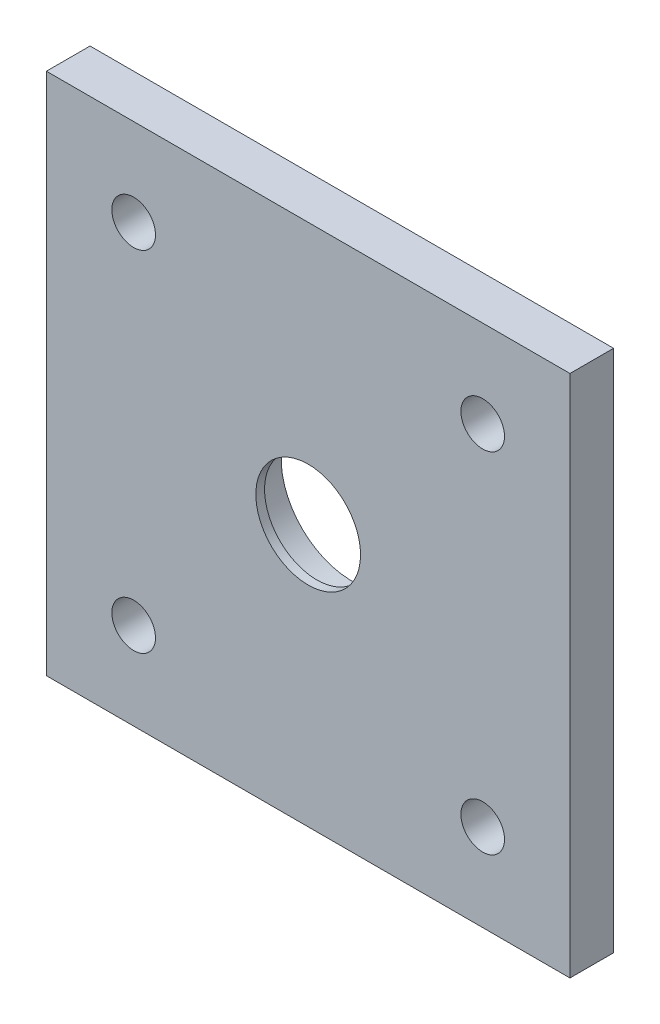
ISO-10303-21;
HEADER;
FILE_DESCRIPTION(('STEP AP214'),'2;1');
FILE_NAME('part.step','',(''),(''),'','','');
FILE_SCHEMA(('AUTOMOTIVE_DESIGN { 1 0 10303 214 1 1 1 1 }'));
ENDSEC;
DATA;
#1=APPLICATION_CONTEXT('core data for automotive mechanical design processes');
#2=APPLICATION_PROTOCOL_DEFINITION('international standard','automotive_design',2000,#1);
#3=PRODUCT_CONTEXT('',#1,'mechanical');
#4=PRODUCT('Part','Part','',(#3));
#5=PRODUCT_RELATED_PRODUCT_CATEGORY('part','',(#4));
#6=PRODUCT_DEFINITION_FORMATION('','',#4);
#7=PRODUCT_DEFINITION_CONTEXT('part definition',#1,'design');
#8=PRODUCT_DEFINITION('design','',#6,#7);
#9=PRODUCT_DEFINITION_SHAPE('','',#8);
#10=(LENGTH_UNIT() NAMED_UNIT(*) SI_UNIT(.MILLI.,.METRE.));
#11=(NAMED_UNIT(*) PLANE_ANGLE_UNIT() SI_UNIT($,.RADIAN.));
#12=(NAMED_UNIT(*) SI_UNIT($,.STERADIAN.) SOLID_ANGLE_UNIT());
#13=UNCERTAINTY_MEASURE_WITH_UNIT(LENGTH_MEASURE(1.E-05),#10,'distance_accuracy_value','');
#14=(GEOMETRIC_REPRESENTATION_CONTEXT(3) GLOBAL_UNCERTAINTY_ASSIGNED_CONTEXT((#13)) GLOBAL_UNIT_ASSIGNED_CONTEXT((#10,
#11,#12)) REPRESENTATION_CONTEXT('',''));
#15=CARTESIAN_POINT('',(0.,0.,0.));
#16=DIRECTION('',(0.,0.,1.));
#17=DIRECTION('',(1.,0.,0.));
#18=AXIS2_PLACEMENT_3D('',#15,#16,#17);
#19=CARTESIAN_POINT('',(0.,0.,6.34999999999999));
#20=DIRECTION('',(0.,0.,-1.));
#21=DIRECTION('',(-1.,0.,0.));
#22=AXIS2_PLACEMENT_3D('',#19,#20,#21);
#23=PLANE('',#22);
#24=CARTESIAN_POINT('',(-25.3999999999986,-25.4,6.34999999999998));
#25=DIRECTION('',(0.,0.,1.));
#26=DIRECTION('',(1.,0.,0.));
#27=AXIS2_PLACEMENT_3D('',#24,#25,#26);
#28=CIRCLE('',#27,3.175);
#29=CARTESIAN_POINT('',(-22.2249999999986,-25.4,6.34999999999998));
#30=VERTEX_POINT('',#29);
#31=EDGE_CURVE('E145',#30,#30,#28,.T.);
#32=ORIENTED_EDGE('',*,*,#31,.F.);
#33=EDGE_LOOP('',(#32));
#34=FACE_BOUND('',#33,.T.);
#35=CARTESIAN_POINT('',(25.4000000000014,-25.3999999999986,6.34999999999994));
#36=DIRECTION('',(0.,0.,1.));
#37=DIRECTION('',(1.,0.,0.));
#38=AXIS2_PLACEMENT_3D('',#35,#36,#37);
#39=CIRCLE('',#38,3.175);
#40=CARTESIAN_POINT('',(28.5750000000014,-25.3999999999986,6.34999999999994));
#41=VERTEX_POINT('',#40);
#42=EDGE_CURVE('E151',#41,#41,#39,.T.);
#43=ORIENTED_EDGE('',*,*,#42,.F.);
#44=EDGE_LOOP('',(#43));
#45=FACE_BOUND('',#44,.T.);
#46=CARTESIAN_POINT('',(25.4,25.4000000000014,6.34999999999999));
#47=DIRECTION('',(0.,0.,1.));
#48=DIRECTION('',(1.,0.,0.));
#49=AXIS2_PLACEMENT_3D('',#46,#47,#48);
#50=CIRCLE('',#49,3.175);
#51=CARTESIAN_POINT('',(28.575,25.4000000000014,6.34999999999999));
#52=VERTEX_POINT('',#51);
#53=EDGE_CURVE('E157',#52,#52,#50,.T.);
#54=ORIENTED_EDGE('',*,*,#53,.F.);
#55=EDGE_LOOP('',(#54));
#56=FACE_BOUND('',#55,.T.);
#57=CARTESIAN_POINT('',(-25.4,25.4,6.34999999999999));
#58=DIRECTION('',(0.,0.,1.));
#59=DIRECTION('',(1.,0.,0.));
#60=AXIS2_PLACEMENT_3D('',#57,#58,#59);
#61=CIRCLE('',#60,3.175);
#62=CARTESIAN_POINT('',(-22.225,25.4,6.34999999999999));
#63=VERTEX_POINT('',#62);
#64=EDGE_CURVE('E139',#63,#63,#61,.T.);
#65=ORIENTED_EDGE('',*,*,#64,.F.);
#66=EDGE_LOOP('',(#65));
#67=FACE_BOUND('',#66,.T.);
#68=DIRECTION('',(0.,1.,0.));
#69=VECTOR('',#68,1.);
#70=CARTESIAN_POINT('',(38.1,-38.1000000000001,6.34999999999994));
#71=LINE('',#70,#69);
#72=CARTESIAN_POINT('',(38.1,-38.1000000000001,6.34999999999994));
#73=VERTEX_POINT('',#72);
#74=CARTESIAN_POINT('',(38.1,38.1,6.34999999999999));
#75=VERTEX_POINT('',#74);
#76=EDGE_CURVE('E103',#73,#75,#71,.T.);
#77=ORIENTED_EDGE('',*,*,#76,.T.);
#78=DIRECTION('',(-1.,0.,0.));
#79=VECTOR('',#78,1.);
#80=CARTESIAN_POINT('',(-38.1,38.1,6.34999999999999));
#81=LINE('',#80,#79);
#82=CARTESIAN_POINT('',(-38.1,38.1,6.34999999999999));
#83=VERTEX_POINT('',#82);
#84=EDGE_CURVE('E98',#75,#83,#81,.T.);
#85=ORIENTED_EDGE('',*,*,#84,.T.);
#86=DIRECTION('',(0.,-1.,0.));
#87=VECTOR('',#86,1.);
#88=CARTESIAN_POINT('',(-38.1,-38.1,6.34999999999994));
#89=LINE('',#88,#87);
#90=CARTESIAN_POINT('',(-38.1,-38.1,6.34999999999994));
#91=VERTEX_POINT('',#90);
#92=EDGE_CURVE('E101',#83,#91,#89,.T.);
#93=ORIENTED_EDGE('',*,*,#92,.T.);
#94=DIRECTION('',(1.,0.,0.));
#95=VECTOR('',#94,1.);
#96=CARTESIAN_POINT('',(-38.1,-38.1,6.34999999999994));
#97=LINE('',#96,#95);
#98=EDGE_CURVE('E68',#91,#73,#97,.T.);
#99=ORIENTED_EDGE('',*,*,#98,.T.);
#100=EDGE_LOOP('',(#77,#85,#93,#99));
#101=FACE_BOUND('',#100,.T.);
#102=CARTESIAN_POINT('',(0.,0.,6.34999999999999));
#103=DIRECTION('',(0.,0.,1.));
#104=DIRECTION('',(1.,0.,0.));
#105=AXIS2_PLACEMENT_3D('',#102,#103,#104);
#106=CIRCLE('',#105,7.62);
#107=CARTESIAN_POINT('',(7.61999999999999,0.,6.34999999999999));
#108=VERTEX_POINT('',#107);
#109=EDGE_CURVE('E119',#108,#108,#106,.T.);
#110=ORIENTED_EDGE('',*,*,#109,.F.);
#111=EDGE_LOOP('',(#110));
#112=FACE_BOUND('',#111,.T.);
#113=ADVANCED_FACE('F50',(#34,#45,#56,#67,#101,#112),#23,.F.);
#114=CARTESIAN_POINT('',(0.,0.,0.));
#115=DIRECTION('',(0.,0.,-1.));
#116=DIRECTION('',(-1.,0.,0.));
#117=AXIS2_PLACEMENT_3D('',#114,#115,#116);
#118=PLANE('',#117);
#119=CARTESIAN_POINT('',(-25.3999999999986,-25.4,0.));
#120=DIRECTION('',(0.,0.,1.));
#121=DIRECTION('',(1.,0.,0.));
#122=AXIS2_PLACEMENT_3D('',#119,#120,#121);
#123=CIRCLE('',#122,3.175);
#124=CARTESIAN_POINT('',(-22.2249999999986,-25.4,0.));
#125=VERTEX_POINT('',#124);
#126=EDGE_CURVE('E148',#125,#125,#123,.T.);
#127=ORIENTED_EDGE('',*,*,#126,.T.);
#128=EDGE_LOOP('',(#127));
#129=FACE_BOUND('',#128,.T.);
#130=CARTESIAN_POINT('',(25.4000000000014,-25.3999999999986,0.));
#131=DIRECTION('',(0.,0.,1.));
#132=DIRECTION('',(1.,0.,0.));
#133=AXIS2_PLACEMENT_3D('',#130,#131,#132);
#134=CIRCLE('',#133,3.175);
#135=CARTESIAN_POINT('',(28.5750000000014,-25.3999999999986,0.));
#136=VERTEX_POINT('',#135);
#137=EDGE_CURVE('E154',#136,#136,#134,.T.);
#138=ORIENTED_EDGE('',*,*,#137,.T.);
#139=EDGE_LOOP('',(#138));
#140=FACE_BOUND('',#139,.T.);
#141=CARTESIAN_POINT('',(25.4,25.4000000000014,0.));
#142=DIRECTION('',(0.,0.,1.));
#143=DIRECTION('',(1.,0.,0.));
#144=AXIS2_PLACEMENT_3D('',#141,#142,#143);
#145=CIRCLE('',#144,3.175);
#146=CARTESIAN_POINT('',(28.575,25.4000000000014,0.));
#147=VERTEX_POINT('',#146);
#148=EDGE_CURVE('E142',#147,#147,#145,.T.);
#149=ORIENTED_EDGE('',*,*,#148,.T.);
#150=EDGE_LOOP('',(#149));
#151=FACE_BOUND('',#150,.T.);
#152=CARTESIAN_POINT('',(-25.4,25.4,0.));
#153=DIRECTION('',(0.,0.,1.));
#154=DIRECTION('',(1.,0.,0.));
#155=AXIS2_PLACEMENT_3D('',#152,#153,#154);
#156=CIRCLE('',#155,3.175);
#157=CARTESIAN_POINT('',(-22.225,25.4,0.));
#158=VERTEX_POINT('',#157);
#159=EDGE_CURVE('E138',#158,#158,#156,.T.);
#160=ORIENTED_EDGE('',*,*,#159,.T.);
#161=EDGE_LOOP('',(#160));
#162=FACE_BOUND('',#161,.T.);
#163=CARTESIAN_POINT('',(0.,0.,0.));
#164=DIRECTION('',(0.,0.,1.));
#165=DIRECTION('',(1.,0.,0.));
#166=AXIS2_PLACEMENT_3D('',#163,#164,#165);
#167=CIRCLE('',#166,10.287);
#168=CARTESIAN_POINT('',(10.287,0.,0.));
#169=VERTEX_POINT('',#168);
#170=EDGE_CURVE('E135',#169,#169,#167,.T.);
#171=ORIENTED_EDGE('',*,*,#170,.T.);
#172=EDGE_LOOP('',(#171));
#173=FACE_BOUND('',#172,.T.);
#174=DIRECTION('',(0.,1.,0.));
#175=VECTOR('',#174,1.);
#176=CARTESIAN_POINT('',(38.1,-38.1,0.));
#177=LINE('',#176,#175);
#178=CARTESIAN_POINT('',(38.1,-38.1,0.));
#179=VERTEX_POINT('',#178);
#180=CARTESIAN_POINT('',(38.1,38.1,0.));
#181=VERTEX_POINT('',#180);
#182=EDGE_CURVE('E116',#179,#181,#177,.T.);
#183=ORIENTED_EDGE('',*,*,#182,.F.);
#184=DIRECTION('',(1.,0.,0.));
#185=VECTOR('',#184,1.);
#186=CARTESIAN_POINT('',(-38.1,-38.1,0.));
#187=LINE('',#186,#185);
#188=CARTESIAN_POINT('',(-38.1,-38.1,0.));
#189=VERTEX_POINT('',#188);
#190=EDGE_CURVE('E91',#189,#179,#187,.T.);
#191=ORIENTED_EDGE('',*,*,#190,.F.);
#192=DIRECTION('',(0.,-1.,0.));
#193=VECTOR('',#192,1.);
#194=CARTESIAN_POINT('',(-38.1,-38.1,0.));
#195=LINE('',#194,#193);
#196=CARTESIAN_POINT('',(-38.1,38.1,0.));
#197=VERTEX_POINT('',#196);
#198=EDGE_CURVE('E85',#197,#189,#195,.T.);
#199=ORIENTED_EDGE('',*,*,#198,.F.);
#200=DIRECTION('',(-1.,0.,0.));
#201=VECTOR('',#200,1.);
#202=CARTESIAN_POINT('',(-38.1,38.1,0.));
#203=LINE('',#202,#201);
#204=EDGE_CURVE('E107',#181,#197,#203,.T.);
#205=ORIENTED_EDGE('',*,*,#204,.F.);
#206=EDGE_LOOP('',(#183,#191,#199,#205));
#207=FACE_BOUND('',#206,.T.);
#208=ADVANCED_FACE('F127',(#129,#140,#151,#162,#173,#207),#118,.T.);
#209=CARTESIAN_POINT('',(38.1,-38.1000000000001,6.34999999999994));
#210=DIRECTION('',(-1.,0.,0.));
#211=DIRECTION('',(0.,0.,1.));
#212=AXIS2_PLACEMENT_3D('',#209,#210,#211);
#213=PLANE('',#212);
#214=ORIENTED_EDGE('',*,*,#182,.T.);
#215=DIRECTION('',(0.,0.,-1.));
#216=VECTOR('',#215,1.);
#217=CARTESIAN_POINT('',(38.1,38.1,6.34999999999999));
#218=LINE('',#217,#216);
#219=EDGE_CURVE('E14',#75,#181,#218,.T.);
#220=ORIENTED_EDGE('',*,*,#219,.F.);
#221=ORIENTED_EDGE('',*,*,#76,.F.);
#222=DIRECTION('',(0.,0.,-1.));
#223=VECTOR('',#222,1.);
#224=CARTESIAN_POINT('',(38.1,-38.1000000000001,6.34999999999994));
#225=LINE('',#224,#223);
#226=EDGE_CURVE('E112',#73,#179,#225,.T.);
#227=ORIENTED_EDGE('',*,*,#226,.T.);
#228=EDGE_LOOP('',(#214,#220,#221,#227));
#229=FACE_BOUND('',#228,.T.);
#230=ADVANCED_FACE('F52',(#229),#213,.F.);
#231=CARTESIAN_POINT('',(-38.1,38.1,6.34999999999999));
#232=DIRECTION('',(0.,-1.,0.));
#233=DIRECTION('',(0.,0.,-1.));
#234=AXIS2_PLACEMENT_3D('',#231,#232,#233);
#235=PLANE('',#234);
#236=ORIENTED_EDGE('',*,*,#204,.T.);
#237=DIRECTION('',(0.,0.,-1.));
#238=VECTOR('',#237,1.);
#239=CARTESIAN_POINT('',(-38.1,38.1,6.34999999999999));
#240=LINE('',#239,#238);
#241=EDGE_CURVE('E60',#83,#197,#240,.T.);
#242=ORIENTED_EDGE('',*,*,#241,.F.);
#243=ORIENTED_EDGE('',*,*,#84,.F.);
#244=ORIENTED_EDGE('',*,*,#219,.T.);
#245=EDGE_LOOP('',(#236,#242,#243,#244));
#246=FACE_BOUND('',#245,.T.);
#247=ADVANCED_FACE('F106',(#246),#235,.F.);
#248=CARTESIAN_POINT('',(-38.1,-38.1,6.34999999999994));
#249=DIRECTION('',(1.,0.,0.));
#250=DIRECTION('',(0.,0.,-1.));
#251=AXIS2_PLACEMENT_3D('',#248,#249,#250);
#252=PLANE('',#251);
#253=ORIENTED_EDGE('',*,*,#198,.T.);
#254=DIRECTION('',(0.,0.,-1.));
#255=VECTOR('',#254,1.);
#256=CARTESIAN_POINT('',(-38.1,-38.1,6.34999999999994));
#257=LINE('',#256,#255);
#258=EDGE_CURVE('E108',#91,#189,#257,.T.);
#259=ORIENTED_EDGE('',*,*,#258,.F.);
#260=ORIENTED_EDGE('',*,*,#92,.F.);
#261=ORIENTED_EDGE('',*,*,#241,.T.);
#262=EDGE_LOOP('',(#253,#259,#260,#261));
#263=FACE_BOUND('',#262,.T.);
#264=ADVANCED_FACE('F110',(#263),#252,.F.);
#265=CARTESIAN_POINT('',(-38.1,-38.1,6.34999999999994));
#266=DIRECTION('',(0.,1.,0.));
#267=DIRECTION('',(0.,0.,1.));
#268=AXIS2_PLACEMENT_3D('',#265,#266,#267);
#269=PLANE('',#268);
#270=ORIENTED_EDGE('',*,*,#190,.T.);
#271=ORIENTED_EDGE('',*,*,#226,.F.);
#272=ORIENTED_EDGE('',*,*,#98,.F.);
#273=ORIENTED_EDGE('',*,*,#258,.T.);
#274=EDGE_LOOP('',(#270,#271,#272,#273));
#275=FACE_BOUND('',#274,.T.);
#276=ADVANCED_FACE('F124',(#275),#269,.F.);
#277=CARTESIAN_POINT('',(0.,0.,6.34999999999999));
#278=DIRECTION('',(0.,0.,-1.));
#279=DIRECTION('',(-1.,0.,0.));
#280=AXIS2_PLACEMENT_3D('',#277,#278,#279);
#281=CYLINDRICAL_SURFACE('',#280,7.62);
#282=CARTESIAN_POINT('',(0.,0.,5.08));
#283=DIRECTION('',(0.,0.,1.));
#284=DIRECTION('',(1.,0.,0.));
#285=AXIS2_PLACEMENT_3D('',#282,#283,#284);
#286=CIRCLE('',#285,7.62);
#287=CARTESIAN_POINT('',(7.61999999999999,0.,5.08));
#288=VERTEX_POINT('',#287);
#289=EDGE_CURVE('E54',#288,#288,#286,.T.);
#290=ORIENTED_EDGE('',*,*,#289,.F.);
#291=EDGE_LOOP('',(#290));
#292=FACE_BOUND('',#291,.T.);
#293=ORIENTED_EDGE('',*,*,#109,.T.);
#294=EDGE_LOOP('',(#293));
#295=FACE_BOUND('',#294,.T.);
#296=ADVANCED_FACE('F189',(#292,#295),#281,.F.);
#297=CARTESIAN_POINT('',(0.,0.,5.08));
#298=DIRECTION('',(0.,0.,1.));
#299=DIRECTION('',(1.,0.,0.));
#300=AXIS2_PLACEMENT_3D('',#297,#298,#299);
#301=PLANE('',#300);
#302=ORIENTED_EDGE('',*,*,#289,.T.);
#303=EDGE_LOOP('',(#302));
#304=FACE_BOUND('',#303,.T.);
#305=CARTESIAN_POINT('',(0.,0.,5.08));
#306=DIRECTION('',(0.,0.,1.));
#307=DIRECTION('',(1.,0.,0.));
#308=AXIS2_PLACEMENT_3D('',#305,#306,#307);
#309=CIRCLE('',#308,10.287);
#310=CARTESIAN_POINT('',(10.287,0.,5.08));
#311=VERTEX_POINT('',#310);
#312=EDGE_CURVE('E132',#311,#311,#309,.T.);
#313=ORIENTED_EDGE('',*,*,#312,.F.);
#314=EDGE_LOOP('',(#313));
#315=FACE_BOUND('',#314,.T.);
#316=ADVANCED_FACE('F183',(#304,#315),#301,.F.);
#317=CARTESIAN_POINT('',(0.,0.,0.));
#318=DIRECTION('',(0.,0.,1.));
#319=DIRECTION('',(1.,0.,0.));
#320=AXIS2_PLACEMENT_3D('',#317,#318,#319);
#321=CYLINDRICAL_SURFACE('',#320,10.287);
#322=ORIENTED_EDGE('',*,*,#170,.F.);
#323=EDGE_LOOP('',(#322));
#324=FACE_BOUND('',#323,.T.);
#325=ORIENTED_EDGE('',*,*,#312,.T.);
#326=EDGE_LOOP('',(#325));
#327=FACE_BOUND('',#326,.T.);
#328=ADVANCED_FACE('F180',(#324,#327),#321,.F.);
#329=CARTESIAN_POINT('',(-25.4,25.4,0.));
#330=DIRECTION('',(0.,0.,1.));
#331=DIRECTION('',(1.,0.,0.));
#332=AXIS2_PLACEMENT_3D('',#329,#330,#331);
#333=CYLINDRICAL_SURFACE('',#332,3.175);
#334=ORIENTED_EDGE('',*,*,#159,.F.);
#335=EDGE_LOOP('',(#334));
#336=FACE_BOUND('',#335,.T.);
#337=ORIENTED_EDGE('',*,*,#64,.T.);
#338=EDGE_LOOP('',(#337));
#339=FACE_BOUND('',#338,.T.);
#340=ADVANCED_FACE('F169',(#336,#339),#333,.F.);
#341=CARTESIAN_POINT('',(25.4,25.4000000000014,0.));
#342=DIRECTION('',(0.,0.,1.));
#343=DIRECTION('',(1.,0.,0.));
#344=AXIS2_PLACEMENT_3D('',#341,#342,#343);
#345=CYLINDRICAL_SURFACE('',#344,3.175);
#346=ORIENTED_EDGE('',*,*,#148,.F.);
#347=EDGE_LOOP('',(#346));
#348=FACE_BOUND('',#347,.T.);
#349=ORIENTED_EDGE('',*,*,#53,.T.);
#350=EDGE_LOOP('',(#349));
#351=FACE_BOUND('',#350,.T.);
#352=ADVANCED_FACE('F165',(#348,#351),#345,.F.);
#353=CARTESIAN_POINT('',(25.4000000000014,-25.3999999999986,0.));
#354=DIRECTION('',(0.,0.,1.));
#355=DIRECTION('',(1.,0.,0.));
#356=AXIS2_PLACEMENT_3D('',#353,#354,#355);
#357=CYLINDRICAL_SURFACE('',#356,3.175);
#358=ORIENTED_EDGE('',*,*,#137,.F.);
#359=EDGE_LOOP('',(#358));
#360=FACE_BOUND('',#359,.T.);
#361=ORIENTED_EDGE('',*,*,#42,.T.);
#362=EDGE_LOOP('',(#361));
#363=FACE_BOUND('',#362,.T.);
#364=ADVANCED_FACE('F168',(#360,#363),#357,.F.);
#365=CARTESIAN_POINT('',(-25.3999999999986,-25.4,0.));
#366=DIRECTION('',(0.,0.,1.));
#367=DIRECTION('',(1.,0.,0.));
#368=AXIS2_PLACEMENT_3D('',#365,#366,#367);
#369=CYLINDRICAL_SURFACE('',#368,3.175);
#370=ORIENTED_EDGE('',*,*,#126,.F.);
#371=EDGE_LOOP('',(#370));
#372=FACE_BOUND('',#371,.T.);
#373=ORIENTED_EDGE('',*,*,#31,.T.);
#374=EDGE_LOOP('',(#373));
#375=FACE_BOUND('',#374,.T.);
#376=ADVANCED_FACE('F256',(#372,#375),#369,.F.);
#377=CLOSED_SHELL('',(#113,#208,#230,#247,#264,#276,#296,#316,#328,#340,#352,#364,#376));
#378=MANIFOLD_SOLID_BREP('B2',#377);
#379=ADVANCED_BREP_SHAPE_REPRESENTATION('',(#18,#378),#14);
#380=SHAPE_DEFINITION_REPRESENTATION(#9,#379);
ENDSEC;
END-ISO-10303-21;
